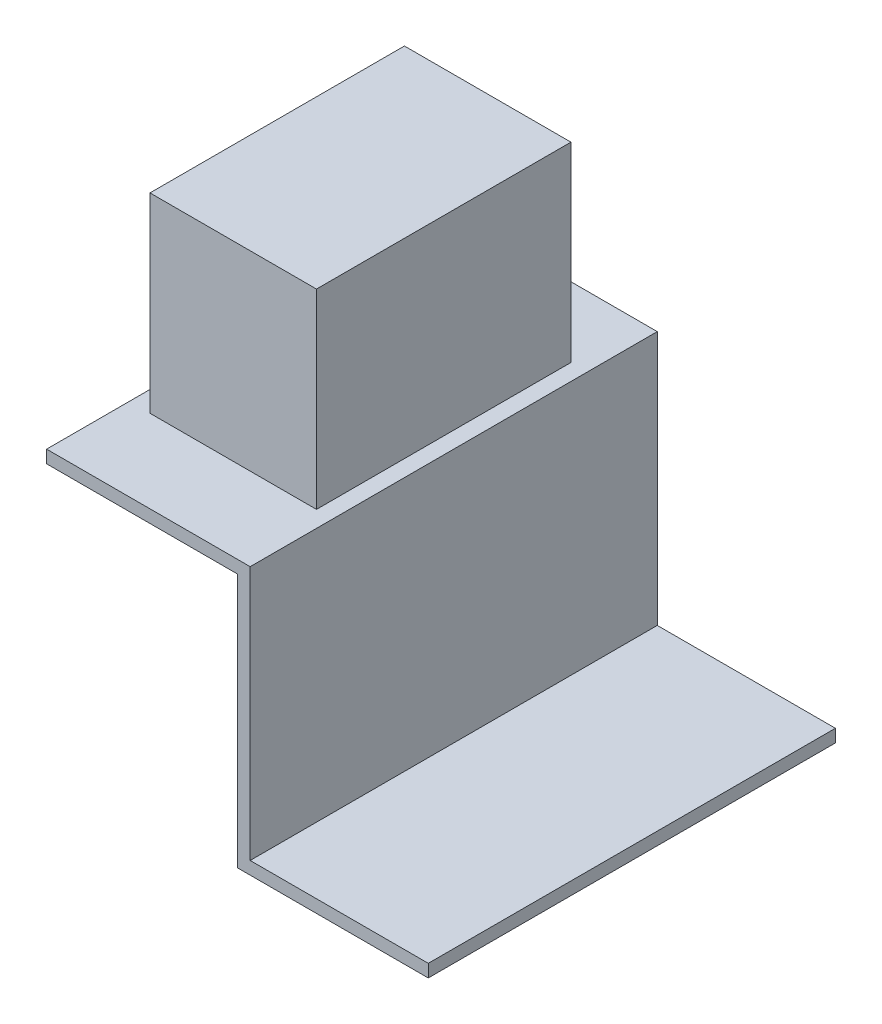
ISO-10303-21;
HEADER;
FILE_DESCRIPTION(('STEP AP214'),'2;1');
FILE_NAME('part.step','',(''),(''),'','','');
FILE_SCHEMA(('AUTOMOTIVE_DESIGN { 1 0 10303 214 1 1 1 1 }'));
ENDSEC;
DATA;
#1=APPLICATION_CONTEXT('core data for automotive mechanical design processes');
#2=APPLICATION_PROTOCOL_DEFINITION('international standard','automotive_design',2000,#1);
#3=PRODUCT_CONTEXT('',#1,'mechanical');
#4=PRODUCT('Part','Part','',(#3));
#5=PRODUCT_RELATED_PRODUCT_CATEGORY('part','',(#4));
#6=PRODUCT_DEFINITION_FORMATION('','',#4);
#7=PRODUCT_DEFINITION_CONTEXT('part definition',#1,'design');
#8=PRODUCT_DEFINITION('design','',#6,#7);
#9=PRODUCT_DEFINITION_SHAPE('','',#8);
#10=(LENGTH_UNIT() NAMED_UNIT(*) SI_UNIT(.MILLI.,.METRE.));
#11=(NAMED_UNIT(*) PLANE_ANGLE_UNIT() SI_UNIT($,.RADIAN.));
#12=(NAMED_UNIT(*) SI_UNIT($,.STERADIAN.) SOLID_ANGLE_UNIT());
#13=UNCERTAINTY_MEASURE_WITH_UNIT(LENGTH_MEASURE(1.E-05),#10,'distance_accuracy_value','');
#14=(GEOMETRIC_REPRESENTATION_CONTEXT(3) GLOBAL_UNCERTAINTY_ASSIGNED_CONTEXT((#13)) GLOBAL_UNIT_ASSIGNED_CONTEXT((#10,
#11,#12)) REPRESENTATION_CONTEXT('',''));
#15=CARTESIAN_POINT('',(0.,0.,0.));
#16=DIRECTION('',(0.,0.,1.));
#17=DIRECTION('',(1.,0.,0.));
#18=AXIS2_PLACEMENT_3D('',#15,#16,#17);
#19=CARTESIAN_POINT('',(-20.8783194636179,36.,-10.503703775145));
#20=DIRECTION('',(1.,0.,0.));
#21=DIRECTION('',(0.,0.,-1.));
#22=AXIS2_PLACEMENT_3D('',#19,#20,#21);
#23=PLANE('',#22);
#24=DIRECTION('',(0.,0.,1.));
#25=VECTOR('',#24,1.);
#26=CARTESIAN_POINT('',(-20.8783194636179,21.,-10.503703775145));
#27=LINE('',#26,#25);
#28=CARTESIAN_POINT('',(-20.8783194636179,21.,-10.503703775145));
#29=VERTEX_POINT('',#28);
#30=CARTESIAN_POINT('',(-20.8783194636179,21.,9.49629622485503));
#31=VERTEX_POINT('',#30);
#32=EDGE_CURVE('E432',#29,#31,#27,.T.);
#33=ORIENTED_EDGE('',*,*,#32,.T.);
#34=DIRECTION('',(0.,-1.,0.));
#35=VECTOR('',#34,1.);
#36=CARTESIAN_POINT('',(-20.8783194636179,36.,9.49629622485503));
#37=LINE('',#36,#35);
#38=CARTESIAN_POINT('',(-20.8783194636179,36.,9.49629622485503));
#39=VERTEX_POINT('',#38);
#40=EDGE_CURVE('E47',#39,#31,#37,.T.);
#41=ORIENTED_EDGE('',*,*,#40,.F.);
#42=DIRECTION('',(0.,0.,1.));
#43=VECTOR('',#42,1.);
#44=CARTESIAN_POINT('',(-20.8783194636179,36.,-10.503703775145));
#45=LINE('',#44,#43);
#46=CARTESIAN_POINT('',(-20.8783194636179,36.,-10.503703775145));
#47=VERTEX_POINT('',#46);
#48=EDGE_CURVE('E131',#47,#39,#45,.T.);
#49=ORIENTED_EDGE('',*,*,#48,.F.);
#50=DIRECTION('',(0.,-1.,0.));
#51=VECTOR('',#50,1.);
#52=CARTESIAN_POINT('',(-20.8783194636179,36.,-10.503703775145));
#53=LINE('',#52,#51);
#54=EDGE_CURVE('E128',#47,#29,#53,.T.);
#55=ORIENTED_EDGE('',*,*,#54,.T.);
#56=EDGE_LOOP('',(#33,#41,#49,#55));
#57=FACE_BOUND('',#56,.T.);
#58=CARTESIAN_POINT('',(-20.8783194636179,28.5,0.));
#59=DIRECTION('',(1.,0.,0.));
#60=DIRECTION('',(0.,0.,-1.));
#61=AXIS2_PLACEMENT_3D('',#58,#59,#60);
#62=CIRCLE('',#61,2.79679786563085);
#63=CARTESIAN_POINT('',(-20.8783194636179,28.5,-2.79679786563085));
#64=VERTEX_POINT('',#63);
#65=EDGE_CURVE('E11',#64,#64,#62,.F.);
#66=ORIENTED_EDGE('',*,*,#65,.F.);
#67=EDGE_LOOP('',(#66));
#68=FACE_BOUND('',#67,.T.);
#69=ADVANCED_FACE('F32',(#57,#68),#23,.F.);
#70=CARTESIAN_POINT('',(-7.5,21.,16.));
#71=DIRECTION('',(0.,1.,0.));
#72=DIRECTION('',(0.,0.,1.));
#73=AXIS2_PLACEMENT_3D('',#70,#71,#72);
#74=PLANE('',#73);
#75=DIRECTION('',(-1.,0.,0.));
#76=VECTOR('',#75,1.);
#77=CARTESIAN_POINT('',(-7.5,21.,-16.));
#78=LINE('',#77,#76);
#79=CARTESIAN_POINT('',(-6.5,21.,-16.));
#80=VERTEX_POINT('',#79);
#81=CARTESIAN_POINT('',(-22.5,21.,-16.));
#82=VERTEX_POINT('',#81);
#83=EDGE_CURVE('E200',#80,#82,#78,.T.);
#84=ORIENTED_EDGE('',*,*,#83,.T.);
#85=DIRECTION('',(0.,0.,-1.));
#86=VECTOR('',#85,1.);
#87=CARTESIAN_POINT('',(-22.5,21.,-16.));
#88=LINE('',#87,#86);
#89=CARTESIAN_POINT('',(-22.5,21.,16.));
#90=VERTEX_POINT('',#89);
#91=EDGE_CURVE('E159',#90,#82,#88,.T.);
#92=ORIENTED_EDGE('',*,*,#91,.F.);
#93=DIRECTION('',(1.,0.,0.));
#94=VECTOR('',#93,1.);
#95=CARTESIAN_POINT('',(-7.5,21.,16.));
#96=LINE('',#95,#94);
#97=CARTESIAN_POINT('',(-6.5,21.,16.));
#98=VERTEX_POINT('',#97);
#99=EDGE_CURVE('E165',#90,#98,#96,.T.);
#100=ORIENTED_EDGE('',*,*,#99,.T.);
#101=DIRECTION('',(0.,0.,-1.));
#102=VECTOR('',#101,1.);
#103=CARTESIAN_POINT('',(-6.5,21.,-16.));
#104=LINE('',#103,#102);
#105=EDGE_CURVE('E188',#98,#80,#104,.T.);
#106=ORIENTED_EDGE('',*,*,#105,.T.);
#107=EDGE_LOOP('',(#84,#92,#100,#106));
#108=FACE_BOUND('',#107,.T.);
#109=DIRECTION('',(-1.,0.,0.));
#110=VECTOR('',#109,1.);
#111=CARTESIAN_POINT('',(-20.8783194636179,21.,-10.503703775145));
#112=LINE('',#111,#110);
#113=CARTESIAN_POINT('',(-7.79104295968304,21.,-10.503703775145));
#114=VERTEX_POINT('',#113);
#115=EDGE_CURVE('E425',#114,#29,#112,.T.);
#116=ORIENTED_EDGE('',*,*,#115,.F.);
#117=DIRECTION('',(0.,0.,-1.));
#118=VECTOR('',#117,1.);
#119=CARTESIAN_POINT('',(-7.79104295968304,21.,-10.503703775145));
#120=LINE('',#119,#118);
#121=CARTESIAN_POINT('',(-7.79104295968304,21.,9.49629622485503));
#122=VERTEX_POINT('',#121);
#123=EDGE_CURVE('E144',#122,#114,#120,.T.);
#124=ORIENTED_EDGE('',*,*,#123,.F.);
#125=DIRECTION('',(1.,0.,0.));
#126=VECTOR('',#125,1.);
#127=CARTESIAN_POINT('',(-20.8783194636179,21.,9.49629622485503));
#128=LINE('',#127,#126);
#129=EDGE_CURVE('E140',#31,#122,#128,.T.);
#130=ORIENTED_EDGE('',*,*,#129,.F.);
#131=ORIENTED_EDGE('',*,*,#32,.F.);
#132=EDGE_LOOP('',(#116,#124,#130,#131));
#133=FACE_BOUND('',#132,.T.);
#134=ADVANCED_FACE('F232',(#108,#133),#74,.T.);
#135=CARTESIAN_POINT('',(-7.5,1.,-16.));
#136=DIRECTION('',(1.,0.,0.));
#137=DIRECTION('',(0.,0.,-1.));
#138=AXIS2_PLACEMENT_3D('',#135,#136,#137);
#139=PLANE('',#138);
#140=DIRECTION('',(0.,0.,1.));
#141=VECTOR('',#140,1.);
#142=CARTESIAN_POINT('',(-7.5,20.,-16.));
#143=LINE('',#142,#141);
#144=CARTESIAN_POINT('',(-7.5,20.,-16.));
#145=VERTEX_POINT('',#144);
#146=CARTESIAN_POINT('',(-7.5,20.,16.));
#147=VERTEX_POINT('',#146);
#148=EDGE_CURVE('E55',#145,#147,#143,.T.);
#149=ORIENTED_EDGE('',*,*,#148,.F.);
#150=DIRECTION('',(0.,-1.,0.));
#151=VECTOR('',#150,1.);
#152=CARTESIAN_POINT('',(-7.5,1.,-16.));
#153=LINE('',#152,#151);
#154=CARTESIAN_POINT('',(-7.5,0.,-16.));
#155=VERTEX_POINT('',#154);
#156=EDGE_CURVE('E169',#145,#155,#153,.T.);
#157=ORIENTED_EDGE('',*,*,#156,.T.);
#158=DIRECTION('',(0.,0.,1.));
#159=VECTOR('',#158,1.);
#160=CARTESIAN_POINT('',(-7.5,0.,-16.));
#161=LINE('',#160,#159);
#162=CARTESIAN_POINT('',(-7.5,0.,16.));
#163=VERTEX_POINT('',#162);
#164=EDGE_CURVE('E257',#155,#163,#161,.T.);
#165=ORIENTED_EDGE('',*,*,#164,.T.);
#166=DIRECTION('',(0.,-1.,0.));
#167=VECTOR('',#166,1.);
#168=CARTESIAN_POINT('',(-7.5,1.,16.));
#169=LINE('',#168,#167);
#170=EDGE_CURVE('E217',#147,#163,#169,.T.);
#171=ORIENTED_EDGE('',*,*,#170,.F.);
#172=EDGE_LOOP('',(#149,#157,#165,#171));
#173=FACE_BOUND('',#172,.T.);
#174=ADVANCED_FACE('F275',(#173),#139,.F.);
#175=CARTESIAN_POINT('',(7.5,1.,-16.));
#176=DIRECTION('',(-1.,0.,0.));
#177=DIRECTION('',(0.,0.,1.));
#178=AXIS2_PLACEMENT_3D('',#175,#176,#177);
#179=PLANE('',#178);
#180=DIRECTION('',(0.,0.,-1.));
#181=VECTOR('',#180,1.);
#182=CARTESIAN_POINT('',(7.5,0.,-16.));
#183=LINE('',#182,#181);
#184=CARTESIAN_POINT('',(7.5,0.,16.));
#185=VERTEX_POINT('',#184);
#186=CARTESIAN_POINT('',(7.5,0.,-16.));
#187=VERTEX_POINT('',#186);
#188=EDGE_CURVE('E222',#185,#187,#183,.T.);
#189=ORIENTED_EDGE('',*,*,#188,.T.);
#190=DIRECTION('',(0.,-1.,0.));
#191=VECTOR('',#190,1.);
#192=CARTESIAN_POINT('',(7.5,1.,-16.));
#193=LINE('',#192,#191);
#194=CARTESIAN_POINT('',(7.5,1.,-16.));
#195=VERTEX_POINT('',#194);
#196=EDGE_CURVE('E40',#195,#187,#193,.T.);
#197=ORIENTED_EDGE('',*,*,#196,.F.);
#198=DIRECTION('',(0.,0.,-1.));
#199=VECTOR('',#198,1.);
#200=CARTESIAN_POINT('',(7.5,1.,-16.));
#201=LINE('',#200,#199);
#202=CARTESIAN_POINT('',(7.5,1.,16.));
#203=VERTEX_POINT('',#202);
#204=EDGE_CURVE('E201',#203,#195,#201,.T.);
#205=ORIENTED_EDGE('',*,*,#204,.F.);
#206=DIRECTION('',(0.,-1.,0.));
#207=VECTOR('',#206,1.);
#208=CARTESIAN_POINT('',(7.5,1.,16.));
#209=LINE('',#208,#207);
#210=EDGE_CURVE('E215',#203,#185,#209,.T.);
#211=ORIENTED_EDGE('',*,*,#210,.T.);
#212=EDGE_LOOP('',(#189,#197,#205,#211));
#213=FACE_BOUND('',#212,.T.);
#214=ADVANCED_FACE('F34',(#213),#179,.F.);
#215=CARTESIAN_POINT('',(-7.5,1.,-16.));
#216=DIRECTION('',(0.,0.,1.));
#217=DIRECTION('',(1.,0.,0.));
#218=AXIS2_PLACEMENT_3D('',#215,#216,#217);
#219=PLANE('',#218);
#220=DIRECTION('',(-1.,0.,0.));
#221=VECTOR('',#220,1.);
#222=CARTESIAN_POINT('',(-7.5,0.,-16.));
#223=LINE('',#222,#221);
#224=EDGE_CURVE('E227',#187,#155,#223,.T.);
#225=ORIENTED_EDGE('',*,*,#224,.T.);
#226=ORIENTED_EDGE('',*,*,#156,.F.);
#227=DIRECTION('',(1.,0.,0.));
#228=VECTOR('',#227,1.);
#229=CARTESIAN_POINT('',(-22.5,20.,-16.));
#230=LINE('',#229,#228);
#231=CARTESIAN_POINT('',(-22.5,20.,-16.));
#232=VERTEX_POINT('',#231);
#233=EDGE_CURVE('E174',#232,#145,#230,.T.);
#234=ORIENTED_EDGE('',*,*,#233,.F.);
#235=DIRECTION('',(0.,-1.,0.));
#236=VECTOR('',#235,1.);
#237=CARTESIAN_POINT('',(-22.5,21.,-16.));
#238=LINE('',#237,#236);
#239=EDGE_CURVE('E147',#82,#232,#238,.T.);
#240=ORIENTED_EDGE('',*,*,#239,.F.);
#241=ORIENTED_EDGE('',*,*,#83,.F.);
#242=DIRECTION('',(0.,-1.,0.));
#243=VECTOR('',#242,1.);
#244=CARTESIAN_POINT('',(-6.5,21.,-16.));
#245=LINE('',#244,#243);
#246=CARTESIAN_POINT('',(-6.5,1.,-16.));
#247=VERTEX_POINT('',#246);
#248=EDGE_CURVE('E195',#80,#247,#245,.T.);
#249=ORIENTED_EDGE('',*,*,#248,.T.);
#250=DIRECTION('',(-1.,0.,0.));
#251=VECTOR('',#250,1.);
#252=CARTESIAN_POINT('',(-7.5,1.,-16.));
#253=LINE('',#252,#251);
#254=EDGE_CURVE('E204',#195,#247,#253,.T.);
#255=ORIENTED_EDGE('',*,*,#254,.F.);
#256=ORIENTED_EDGE('',*,*,#196,.T.);
#257=EDGE_LOOP('',(#225,#226,#234,#240,#241,#249,#255,#256));
#258=FACE_BOUND('',#257,.T.);
#259=ADVANCED_FACE('F237',(#258),#219,.F.);
#260=CARTESIAN_POINT('',(-7.5,1.,16.));
#261=DIRECTION('',(0.,0.,-1.));
#262=DIRECTION('',(-1.,0.,0.));
#263=AXIS2_PLACEMENT_3D('',#260,#261,#262);
#264=PLANE('',#263);
#265=DIRECTION('',(1.,0.,0.));
#266=VECTOR('',#265,1.);
#267=CARTESIAN_POINT('',(-7.5,0.,16.));
#268=LINE('',#267,#266);
#269=EDGE_CURVE('E205',#163,#185,#268,.T.);
#270=ORIENTED_EDGE('',*,*,#269,.T.);
#271=ORIENTED_EDGE('',*,*,#210,.F.);
#272=DIRECTION('',(1.,0.,0.));
#273=VECTOR('',#272,1.);
#274=CARTESIAN_POINT('',(-7.5,1.,16.));
#275=LINE('',#274,#273);
#276=CARTESIAN_POINT('',(-6.5,1.,16.));
#277=VERTEX_POINT('',#276);
#278=EDGE_CURVE('E192',#277,#203,#275,.T.);
#279=ORIENTED_EDGE('',*,*,#278,.F.);
#280=DIRECTION('',(0.,-1.,0.));
#281=VECTOR('',#280,1.);
#282=CARTESIAN_POINT('',(-6.5,21.,16.));
#283=LINE('',#282,#281);
#284=EDGE_CURVE('E221',#98,#277,#283,.T.);
#285=ORIENTED_EDGE('',*,*,#284,.F.);
#286=ORIENTED_EDGE('',*,*,#99,.F.);
#287=DIRECTION('',(0.,1.,0.));
#288=VECTOR('',#287,1.);
#289=CARTESIAN_POINT('',(-22.5,21.,16.));
#290=LINE('',#289,#288);
#291=CARTESIAN_POINT('',(-22.5,20.,16.));
#292=VERTEX_POINT('',#291);
#293=EDGE_CURVE('E156',#292,#90,#290,.T.);
#294=ORIENTED_EDGE('',*,*,#293,.F.);
#295=DIRECTION('',(1.,0.,0.));
#296=VECTOR('',#295,1.);
#297=CARTESIAN_POINT('',(-22.5,20.,16.));
#298=LINE('',#297,#296);
#299=EDGE_CURVE('E162',#292,#147,#298,.T.);
#300=ORIENTED_EDGE('',*,*,#299,.T.);
#301=ORIENTED_EDGE('',*,*,#170,.T.);
#302=EDGE_LOOP('',(#270,#271,#279,#285,#286,#294,#300,#301));
#303=FACE_BOUND('',#302,.T.);
#304=ADVANCED_FACE('F243',(#303),#264,.F.);
#305=CARTESIAN_POINT('',(7.5,1.,16.));
#306=DIRECTION('',(0.,1.,0.));
#307=DIRECTION('',(0.,0.,1.));
#308=AXIS2_PLACEMENT_3D('',#305,#306,#307);
#309=PLANE('',#308);
#310=DIRECTION('',(0.,0.,-1.));
#311=VECTOR('',#310,1.);
#312=CARTESIAN_POINT('',(-6.5,1.,-16.));
#313=LINE('',#312,#311);
#314=EDGE_CURVE('E178',#277,#247,#313,.T.);
#315=ORIENTED_EDGE('',*,*,#314,.F.);
#316=ORIENTED_EDGE('',*,*,#278,.T.);
#317=ORIENTED_EDGE('',*,*,#204,.T.);
#318=ORIENTED_EDGE('',*,*,#254,.T.);
#319=EDGE_LOOP('',(#315,#316,#317,#318));
#320=FACE_BOUND('',#319,.T.);
#321=ADVANCED_FACE('F259',(#320),#309,.T.);
#322=CARTESIAN_POINT('',(7.5,0.,16.));
#323=DIRECTION('',(0.,1.,0.));
#324=DIRECTION('',(0.,0.,1.));
#325=AXIS2_PLACEMENT_3D('',#322,#323,#324);
#326=PLANE('',#325);
#327=ORIENTED_EDGE('',*,*,#188,.F.);
#328=ORIENTED_EDGE('',*,*,#269,.F.);
#329=ORIENTED_EDGE('',*,*,#164,.F.);
#330=ORIENTED_EDGE('',*,*,#224,.F.);
#331=EDGE_LOOP('',(#327,#328,#329,#330));
#332=FACE_BOUND('',#331,.T.);
#333=ADVANCED_FACE('F254',(#332),#326,.F.);
#334=CARTESIAN_POINT('',(-6.5,21.,-16.));
#335=DIRECTION('',(-1.,0.,0.));
#336=DIRECTION('',(0.,0.,1.));
#337=AXIS2_PLACEMENT_3D('',#334,#335,#336);
#338=PLANE('',#337);
#339=ORIENTED_EDGE('',*,*,#314,.T.);
#340=ORIENTED_EDGE('',*,*,#248,.F.);
#341=ORIENTED_EDGE('',*,*,#105,.F.);
#342=ORIENTED_EDGE('',*,*,#284,.T.);
#343=EDGE_LOOP('',(#339,#340,#341,#342));
#344=FACE_BOUND('',#343,.T.);
#345=ADVANCED_FACE('F234',(#344),#338,.F.);
#346=CARTESIAN_POINT('',(-22.5,20.,-16.));
#347=DIRECTION('',(0.,1.,0.));
#348=DIRECTION('',(0.,0.,1.));
#349=AXIS2_PLACEMENT_3D('',#346,#347,#348);
#350=PLANE('',#349);
#351=ORIENTED_EDGE('',*,*,#148,.T.);
#352=ORIENTED_EDGE('',*,*,#299,.F.);
#353=DIRECTION('',(0.,0.,1.));
#354=VECTOR('',#353,1.);
#355=CARTESIAN_POINT('',(-22.5,20.,-16.));
#356=LINE('',#355,#354);
#357=EDGE_CURVE('E154',#232,#292,#356,.T.);
#358=ORIENTED_EDGE('',*,*,#357,.F.);
#359=ORIENTED_EDGE('',*,*,#233,.T.);
#360=EDGE_LOOP('',(#351,#352,#358,#359));
#361=FACE_BOUND('',#360,.T.);
#362=ADVANCED_FACE('F288',(#361),#350,.F.);
#363=CARTESIAN_POINT('',(-22.5,20.,-16.));
#364=DIRECTION('',(-1.,0.,0.));
#365=DIRECTION('',(0.,0.,1.));
#366=AXIS2_PLACEMENT_3D('',#363,#364,#365);
#367=PLANE('',#366);
#368=ORIENTED_EDGE('',*,*,#239,.T.);
#369=ORIENTED_EDGE('',*,*,#357,.T.);
#370=ORIENTED_EDGE('',*,*,#293,.T.);
#371=ORIENTED_EDGE('',*,*,#91,.T.);
#372=EDGE_LOOP('',(#368,#369,#370,#371));
#373=FACE_BOUND('',#372,.T.);
#374=ADVANCED_FACE('F239',(#373),#367,.T.);
#375=CARTESIAN_POINT('',(-7.79104295968304,36.,-10.503703775145));
#376=DIRECTION('',(-1.,0.,0.));
#377=DIRECTION('',(0.,0.,1.));
#378=AXIS2_PLACEMENT_3D('',#375,#376,#377);
#379=PLANE('',#378);
#380=ORIENTED_EDGE('',*,*,#123,.T.);
#381=DIRECTION('',(0.,-1.,0.));
#382=VECTOR('',#381,1.);
#383=CARTESIAN_POINT('',(-7.79104295968304,36.,-10.503703775145));
#384=LINE('',#383,#382);
#385=CARTESIAN_POINT('',(-7.79104295968304,36.,-10.503703775145));
#386=VERTEX_POINT('',#385);
#387=EDGE_CURVE('E125',#386,#114,#384,.T.);
#388=ORIENTED_EDGE('',*,*,#387,.F.);
#389=DIRECTION('',(0.,0.,-1.));
#390=VECTOR('',#389,1.);
#391=CARTESIAN_POINT('',(-7.79104295968304,36.,-10.503703775145));
#392=LINE('',#391,#390);
#393=CARTESIAN_POINT('',(-7.79104295968304,36.,9.49629622485503));
#394=VERTEX_POINT('',#393);
#395=EDGE_CURVE('E132',#394,#386,#392,.T.);
#396=ORIENTED_EDGE('',*,*,#395,.F.);
#397=DIRECTION('',(0.,-1.,0.));
#398=VECTOR('',#397,1.);
#399=CARTESIAN_POINT('',(-7.79104295968304,36.,9.49629622485503));
#400=LINE('',#399,#398);
#401=EDGE_CURVE('E429',#394,#122,#400,.T.);
#402=ORIENTED_EDGE('',*,*,#401,.T.);
#403=EDGE_LOOP('',(#380,#388,#396,#402));
#404=FACE_BOUND('',#403,.T.);
#405=ADVANCED_FACE('F142',(#404),#379,.F.);
#406=CARTESIAN_POINT('',(-20.8783194636179,36.,-10.503703775145));
#407=DIRECTION('',(0.,0.,1.));
#408=DIRECTION('',(1.,0.,0.));
#409=AXIS2_PLACEMENT_3D('',#406,#407,#408);
#410=PLANE('',#409);
#411=ORIENTED_EDGE('',*,*,#115,.T.);
#412=ORIENTED_EDGE('',*,*,#54,.F.);
#413=DIRECTION('',(-1.,0.,0.));
#414=VECTOR('',#413,1.);
#415=CARTESIAN_POINT('',(-20.8783194636179,36.,-10.503703775145));
#416=LINE('',#415,#414);
#417=EDGE_CURVE('E121',#386,#47,#416,.T.);
#418=ORIENTED_EDGE('',*,*,#417,.F.);
#419=ORIENTED_EDGE('',*,*,#387,.T.);
#420=EDGE_LOOP('',(#411,#412,#418,#419));
#421=FACE_BOUND('',#420,.T.);
#422=ADVANCED_FACE('F123',(#421),#410,.F.);
#423=CARTESIAN_POINT('',(-20.8783194636179,36.,9.49629622485503));
#424=DIRECTION('',(0.,0.,-1.));
#425=DIRECTION('',(-1.,0.,0.));
#426=AXIS2_PLACEMENT_3D('',#423,#424,#425);
#427=PLANE('',#426);
#428=ORIENTED_EDGE('',*,*,#129,.T.);
#429=ORIENTED_EDGE('',*,*,#401,.F.);
#430=DIRECTION('',(1.,0.,0.));
#431=VECTOR('',#430,1.);
#432=CARTESIAN_POINT('',(-20.8783194636179,36.,9.49629622485503));
#433=LINE('',#432,#431);
#434=EDGE_CURVE('E136',#39,#394,#433,.T.);
#435=ORIENTED_EDGE('',*,*,#434,.F.);
#436=ORIENTED_EDGE('',*,*,#40,.T.);
#437=EDGE_LOOP('',(#428,#429,#435,#436));
#438=FACE_BOUND('',#437,.T.);
#439=ADVANCED_FACE('F280',(#438),#427,.F.);
#440=CARTESIAN_POINT('',(-7.79104295968304,36.,9.49629622485503));
#441=DIRECTION('',(0.,1.,0.));
#442=DIRECTION('',(0.,0.,1.));
#443=AXIS2_PLACEMENT_3D('',#440,#441,#442);
#444=PLANE('',#443);
#445=ORIENTED_EDGE('',*,*,#395,.T.);
#446=ORIENTED_EDGE('',*,*,#417,.T.);
#447=ORIENTED_EDGE('',*,*,#48,.T.);
#448=ORIENTED_EDGE('',*,*,#434,.T.);
#449=EDGE_LOOP('',(#445,#446,#447,#448));
#450=FACE_BOUND('',#449,.T.);
#451=ADVANCED_FACE('F135',(#450),#444,.T.);
#452=CARTESIAN_POINT('',(-23.8783194636179,28.5,0.));
#453=DIRECTION('',(1.,0.,0.));
#454=DIRECTION('',(0.,0.,-1.));
#455=AXIS2_PLACEMENT_3D('',#452,#453,#454);
#456=CYLINDRICAL_SURFACE('',#455,2.79679786563085);
#457=CARTESIAN_POINT('',(-23.8783194636179,28.5,0.));
#458=DIRECTION('',(-1.,0.,0.));
#459=DIRECTION('',(0.,0.,1.));
#460=AXIS2_PLACEMENT_3D('',#457,#458,#459);
#461=CIRCLE('',#460,2.79679786563085);
#462=CARTESIAN_POINT('',(-23.8783194636179,28.5,2.79679786563086));
#463=VERTEX_POINT('',#462);
#464=EDGE_CURVE('E423',#463,#463,#461,.T.);
#465=ORIENTED_EDGE('',*,*,#464,.F.);
#466=EDGE_LOOP('',(#465));
#467=FACE_BOUND('',#466,.T.);
#468=ORIENTED_EDGE('',*,*,#65,.T.);
#469=EDGE_LOOP('',(#468));
#470=FACE_BOUND('',#469,.T.);
#471=ADVANCED_FACE('F325',(#467,#470),#456,.T.);
#472=CARTESIAN_POINT('',(-23.8783194636179,28.5,0.));
#473=DIRECTION('',(-1.,0.,0.));
#474=DIRECTION('',(0.,0.,1.));
#475=AXIS2_PLACEMENT_3D('',#472,#473,#474);
#476=PLANE('',#475);
#477=ORIENTED_EDGE('',*,*,#464,.T.);
#478=EDGE_LOOP('',(#477));
#479=FACE_BOUND('',#478,.T.);
#480=ADVANCED_FACE('F331',(#479),#476,.T.);
#481=CLOSED_SHELL('',(#69,#134,#174,#214,#259,#304,#321,#333,#345,#362,#374,#405,#422,#439,#451,
#471,#480));
#482=MANIFOLD_SOLID_BREP('B2',#481);
#483=ADVANCED_BREP_SHAPE_REPRESENTATION('',(#18,#482),#14);
#484=SHAPE_DEFINITION_REPRESENTATION(#9,#483);
ENDSEC;
END-ISO-10303-21;
